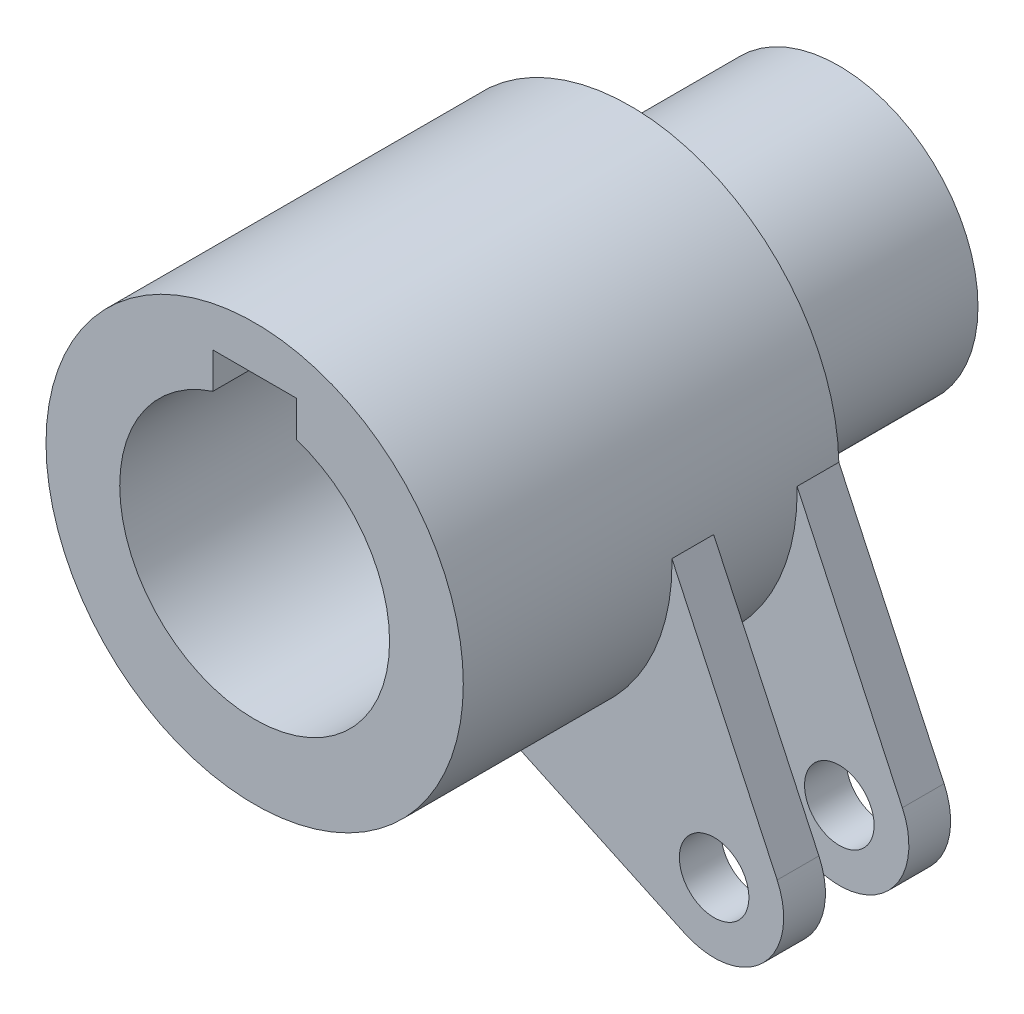
ISO-10303-21;
HEADER;
FILE_DESCRIPTION(('STEP AP214'),'2;1');
FILE_NAME('part.step','',(''),(''),'','','');
FILE_SCHEMA(('AUTOMOTIVE_DESIGN { 1 0 10303 214 1 1 1 1 }'));
ENDSEC;
DATA;
#1=APPLICATION_CONTEXT('core data for automotive mechanical design processes');
#2=APPLICATION_PROTOCOL_DEFINITION('international standard','automotive_design',2000,#1);
#3=PRODUCT_CONTEXT('',#1,'mechanical');
#4=PRODUCT('Part','Part','',(#3));
#5=PRODUCT_RELATED_PRODUCT_CATEGORY('part','',(#4));
#6=PRODUCT_DEFINITION_FORMATION('','',#4);
#7=PRODUCT_DEFINITION_CONTEXT('part definition',#1,'design');
#8=PRODUCT_DEFINITION('design','',#6,#7);
#9=PRODUCT_DEFINITION_SHAPE('','',#8);
#10=(LENGTH_UNIT() NAMED_UNIT(*) SI_UNIT(.MILLI.,.METRE.));
#11=(NAMED_UNIT(*) PLANE_ANGLE_UNIT() SI_UNIT($,.RADIAN.));
#12=(NAMED_UNIT(*) SI_UNIT($,.STERADIAN.) SOLID_ANGLE_UNIT());
#13=UNCERTAINTY_MEASURE_WITH_UNIT(LENGTH_MEASURE(1.E-05),#10,'distance_accuracy_value','');
#14=(GEOMETRIC_REPRESENTATION_CONTEXT(3) GLOBAL_UNCERTAINTY_ASSIGNED_CONTEXT((#13)) GLOBAL_UNIT_ASSIGNED_CONTEXT((#10,
#11,#12)) REPRESENTATION_CONTEXT('',''));
#15=CARTESIAN_POINT('',(0.,0.,0.));
#16=DIRECTION('',(0.,0.,1.));
#17=DIRECTION('',(1.,0.,0.));
#18=AXIS2_PLACEMENT_3D('',#15,#16,#17);
#19=CARTESIAN_POINT('',(0.,0.,0.));
#20=DIRECTION('',(0.,0.,1.));
#21=DIRECTION('',(1.,0.,0.));
#22=AXIS2_PLACEMENT_3D('',#19,#20,#21);
#23=PLANE('',#22);
#24=CARTESIAN_POINT('',(0.,0.,0.));
#25=DIRECTION('',(0.,0.,1.));
#26=DIRECTION('',(1.,0.,0.));
#27=AXIS2_PLACEMENT_3D('',#24,#25,#26);
#28=CIRCLE('',#27,4.1);
#29=CARTESIAN_POINT('',(-2.,3.57910603363466,0.));
#30=VERTEX_POINT('',#29);
#31=CARTESIAN_POINT('',(2.,3.57910603363466,0.));
#32=VERTEX_POINT('',#31);
#33=EDGE_CURVE('E320',#30,#32,#28,.T.);
#34=ORIENTED_EDGE('',*,*,#33,.F.);
#35=DIRECTION('',(0.,1.,0.));
#36=VECTOR('',#35,1.);
#37=CARTESIAN_POINT('',(-2.,0.,0.));
#38=LINE('',#37,#36);
#39=CARTESIAN_POINT('',(-2.,5.1,0.));
#40=VERTEX_POINT('',#39);
#41=EDGE_CURVE('E332',#30,#40,#38,.T.);
#42=ORIENTED_EDGE('',*,*,#41,.T.);
#43=DIRECTION('',(1.,0.,0.));
#44=VECTOR('',#43,1.);
#45=CARTESIAN_POINT('',(0.,5.1,0.));
#46=LINE('',#45,#44);
#47=CARTESIAN_POINT('',(2.,5.1,0.));
#48=VERTEX_POINT('',#47);
#49=EDGE_CURVE('E335',#40,#48,#46,.T.);
#50=ORIENTED_EDGE('',*,*,#49,.T.);
#51=DIRECTION('',(0.,1.,0.));
#52=VECTOR('',#51,1.);
#53=CARTESIAN_POINT('',(2.,0.,0.));
#54=LINE('',#53,#52);
#55=EDGE_CURVE('E329',#32,#48,#54,.T.);
#56=ORIENTED_EDGE('',*,*,#55,.F.);
#57=EDGE_LOOP('',(#34,#42,#50,#56));
#58=FACE_BOUND('',#57,.T.);
#59=DIRECTION('',(0.,-1.,0.));
#60=VECTOR('',#59,1.);
#61=CARTESIAN_POINT('',(-3.,0.,0.));
#62=LINE('',#61,#60);
#63=CARTESIAN_POINT('',(-3.,11.8,0.));
#64=VERTEX_POINT('',#63);
#65=CARTESIAN_POINT('',(-3.,9.22442410126508,0.));
#66=VERTEX_POINT('',#65);
#67=EDGE_CURVE('E230',#64,#66,#62,.T.);
#68=ORIENTED_EDGE('',*,*,#67,.T.);
#69=CARTESIAN_POINT('',(0.,0.,0.));
#70=DIRECTION('',(0.,0.,1.));
#71=DIRECTION('',(1.,0.,0.));
#72=AXIS2_PLACEMENT_3D('',#69,#70,#71);
#73=CIRCLE('',#72,9.7);
#74=CARTESIAN_POINT('',(3.,9.22442410126508,0.));
#75=VERTEX_POINT('',#74);
#76=EDGE_CURVE('E100',#66,#75,#73,.T.);
#77=ORIENTED_EDGE('',*,*,#76,.T.);
#78=DIRECTION('',(0.,-1.,0.));
#79=VECTOR('',#78,1.);
#80=CARTESIAN_POINT('',(3.,0.,0.));
#81=LINE('',#80,#79);
#82=CARTESIAN_POINT('',(3.,11.8,0.));
#83=VERTEX_POINT('',#82);
#84=EDGE_CURVE('E216',#83,#75,#81,.T.);
#85=ORIENTED_EDGE('',*,*,#84,.F.);
#86=DIRECTION('',(1.,0.,0.));
#87=VECTOR('',#86,1.);
#88=CARTESIAN_POINT('',(0.,11.8,0.));
#89=LINE('',#88,#87);
#90=EDGE_CURVE('E232',#64,#83,#89,.T.);
#91=ORIENTED_EDGE('',*,*,#90,.F.);
#92=EDGE_LOOP('',(#68,#77,#85,#91));
#93=FACE_BOUND('',#92,.T.);
#94=ADVANCED_FACE('F83',(#58,#93),#23,.T.);
#95=CARTESIAN_POINT('',(0.,0.,-12.));
#96=DIRECTION('',(0.,0.,1.));
#97=DIRECTION('',(1.,0.,0.));
#98=AXIS2_PLACEMENT_3D('',#95,#96,#97);
#99=CYLINDRICAL_SURFACE('',#98,15.);
#100=DIRECTION('',(0.,0.,1.));
#101=VECTOR('',#100,1.);
#102=CARTESIAN_POINT('',(-0.307001553926883,-14.996858005792,-3.));
#103=LINE('',#102,#101);
#104=CARTESIAN_POINT('',(-0.307001553926883,-14.996858005792,-3.));
#105=VERTEX_POINT('',#104);
#106=CARTESIAN_POINT('',(-0.307001553926883,-14.996858005792,0.));
#107=VERTEX_POINT('',#106);
#108=EDGE_CURVE('E321',#105,#107,#103,.T.);
#109=ORIENTED_EDGE('',*,*,#108,.T.);
#110=CARTESIAN_POINT('',(0.,0.,0.));
#111=DIRECTION('',(0.,0.,1.));
#112=DIRECTION('',(1.,0.,0.));
#113=AXIS2_PLACEMENT_3D('',#110,#111,#112);
#114=CIRCLE('',#113,15.);
#115=CARTESIAN_POINT('',(14.996858005792,0.307001553926838,0.));
#116=VERTEX_POINT('',#115);
#117=EDGE_CURVE('E12',#107,#116,#114,.T.);
#118=ORIENTED_EDGE('',*,*,#117,.T.);
#119=DIRECTION('',(0.,0.,1.));
#120=VECTOR('',#119,1.);
#121=CARTESIAN_POINT('',(14.996858005792,0.307001553926839,-3.));
#122=LINE('',#121,#120);
#123=CARTESIAN_POINT('',(14.996858005792,0.307001553926839,-3.));
#124=VERTEX_POINT('',#123);
#125=EDGE_CURVE('E324',#124,#116,#122,.T.);
#126=ORIENTED_EDGE('',*,*,#125,.F.);
#127=CARTESIAN_POINT('',(0.,0.,-3.));
#128=DIRECTION('',(0.,0.,1.));
#129=DIRECTION('',(1.,0.,0.));
#130=AXIS2_PLACEMENT_3D('',#127,#128,#129);
#131=CIRCLE('',#130,15.);
#132=EDGE_CURVE('E305',#105,#124,#131,.T.);
#133=ORIENTED_EDGE('',*,*,#132,.F.);
#134=EDGE_LOOP('',(#109,#118,#126,#133));
#135=FACE_BOUND('',#134,.T.);
#136=CARTESIAN_POINT('',(0.,0.,-9.));
#137=DIRECTION('',(0.,0.,1.));
#138=DIRECTION('',(1.,0.,0.));
#139=AXIS2_PLACEMENT_3D('',#136,#137,#138);
#140=CIRCLE('',#139,15.);
#141=CARTESIAN_POINT('',(-0.307001553926882,-14.996858005792,-9.));
#142=VERTEX_POINT('',#141);
#143=CARTESIAN_POINT('',(14.996858005792,0.307001553926842,-9.));
#144=VERTEX_POINT('',#143);
#145=EDGE_CURVE('E108',#142,#144,#140,.T.);
#146=ORIENTED_EDGE('',*,*,#145,.T.);
#147=DIRECTION('',(0.,0.,-1.));
#148=VECTOR('',#147,1.);
#149=CARTESIAN_POINT('',(14.996858005792,0.307001553926839,-9.));
#150=LINE('',#149,#148);
#151=CARTESIAN_POINT('',(14.996858005792,0.307001553926839,-12.));
#152=VERTEX_POINT('',#151);
#153=EDGE_CURVE('E287',#144,#152,#150,.T.);
#154=ORIENTED_EDGE('',*,*,#153,.T.);
#155=CARTESIAN_POINT('',(0.,0.,-12.));
#156=DIRECTION('',(0.,0.,1.));
#157=DIRECTION('',(1.,0.,0.));
#158=AXIS2_PLACEMENT_3D('',#155,#156,#157);
#159=CIRCLE('',#158,15.);
#160=CARTESIAN_POINT('',(-0.307001553926894,-14.996858005792,-12.));
#161=VERTEX_POINT('',#160);
#162=EDGE_CURVE('E327',#152,#161,#159,.T.);
#163=ORIENTED_EDGE('',*,*,#162,.T.);
#164=DIRECTION('',(0.,0.,-1.));
#165=VECTOR('',#164,1.);
#166=CARTESIAN_POINT('',(-0.307001553926885,-14.996858005792,-9.));
#167=LINE('',#166,#165);
#168=EDGE_CURVE('E284',#142,#161,#167,.T.);
#169=ORIENTED_EDGE('',*,*,#168,.F.);
#170=EDGE_LOOP('',(#146,#154,#163,#169));
#171=FACE_BOUND('',#170,.T.);
#172=CARTESIAN_POINT('',(0.,0.,15.));
#173=DIRECTION('',(0.,0.,1.));
#174=DIRECTION('',(1.,0.,0.));
#175=AXIS2_PLACEMENT_3D('',#172,#173,#174);
#176=CIRCLE('',#175,15.);
#177=CARTESIAN_POINT('',(15.,0.,15.));
#178=VERTEX_POINT('',#177);
#179=EDGE_CURVE('E225',#178,#178,#176,.T.);
#180=ORIENTED_EDGE('',*,*,#179,.F.);
#181=EDGE_LOOP('',(#180));
#182=FACE_BOUND('',#181,.T.);
#183=ADVANCED_FACE('F368',(#135,#171,#182),#99,.T.);
#184=CARTESIAN_POINT('',(0.,0.,-12.));
#185=DIRECTION('',(0.,0.,1.));
#186=DIRECTION('',(1.,0.,0.));
#187=AXIS2_PLACEMENT_3D('',#184,#185,#186);
#188=CYLINDRICAL_SURFACE('',#187,4.1);
#189=ORIENTED_EDGE('',*,*,#33,.T.);
#190=DIRECTION('',(0.,0.,1.));
#191=VECTOR('',#190,1.);
#192=CARTESIAN_POINT('',(2.,3.57910603363466,-12.));
#193=LINE('',#192,#191);
#194=CARTESIAN_POINT('',(2.,3.57910603363465,-27.));
#195=VERTEX_POINT('',#194);
#196=EDGE_CURVE('E92',#195,#32,#193,.T.);
#197=ORIENTED_EDGE('',*,*,#196,.F.);
#198=CARTESIAN_POINT('',(0.,0.,-27.));
#199=DIRECTION('',(0.,0.,1.));
#200=DIRECTION('',(1.,0.,0.));
#201=AXIS2_PLACEMENT_3D('',#198,#199,#200);
#202=CIRCLE('',#201,4.1);
#203=CARTESIAN_POINT('',(-2.,3.57910603363466,-27.));
#204=VERTEX_POINT('',#203);
#205=EDGE_CURVE('E246',#204,#195,#202,.T.);
#206=ORIENTED_EDGE('',*,*,#205,.F.);
#207=DIRECTION('',(0.,0.,1.));
#208=VECTOR('',#207,1.);
#209=CARTESIAN_POINT('',(-2.,3.57910603363466,-12.));
#210=LINE('',#209,#208);
#211=EDGE_CURVE('E87',#204,#30,#210,.T.);
#212=ORIENTED_EDGE('',*,*,#211,.T.);
#213=EDGE_LOOP('',(#189,#197,#206,#212));
#214=FACE_BOUND('',#213,.T.);
#215=ADVANCED_FACE('F85',(#214),#188,.F.);
#216=CARTESIAN_POINT('',(2.,0.,-12.));
#217=DIRECTION('',(1.,0.,0.));
#218=DIRECTION('',(0.,0.,-1.));
#219=AXIS2_PLACEMENT_3D('',#216,#217,#218);
#220=PLANE('',#219);
#221=ORIENTED_EDGE('',*,*,#55,.T.);
#222=DIRECTION('',(0.,0.,1.));
#223=VECTOR('',#222,1.);
#224=CARTESIAN_POINT('',(2.,5.1,-12.));
#225=LINE('',#224,#223);
#226=CARTESIAN_POINT('',(2.,5.1,-27.));
#227=VERTEX_POINT('',#226);
#228=EDGE_CURVE('E342',#227,#48,#225,.T.);
#229=ORIENTED_EDGE('',*,*,#228,.F.);
#230=DIRECTION('',(0.,1.,0.));
#231=VECTOR('',#230,1.);
#232=CARTESIAN_POINT('',(2.,0.,-27.));
#233=LINE('',#232,#231);
#234=EDGE_CURVE('E243',#195,#227,#233,.T.);
#235=ORIENTED_EDGE('',*,*,#234,.F.);
#236=ORIENTED_EDGE('',*,*,#196,.T.);
#237=EDGE_LOOP('',(#221,#229,#235,#236));
#238=FACE_BOUND('',#237,.T.);
#239=ADVANCED_FACE('F364',(#238),#220,.F.);
#240=CARTESIAN_POINT('',(0.,5.1,-12.));
#241=DIRECTION('',(0.,-1.,0.));
#242=DIRECTION('',(0.,0.,-1.));
#243=AXIS2_PLACEMENT_3D('',#240,#241,#242);
#244=PLANE('',#243);
#245=ORIENTED_EDGE('',*,*,#49,.F.);
#246=DIRECTION('',(0.,0.,1.));
#247=VECTOR('',#246,1.);
#248=CARTESIAN_POINT('',(-2.,5.1,-12.));
#249=LINE('',#248,#247);
#250=CARTESIAN_POINT('',(-2.,5.1,-27.));
#251=VERTEX_POINT('',#250);
#252=EDGE_CURVE('E343',#251,#40,#249,.T.);
#253=ORIENTED_EDGE('',*,*,#252,.F.);
#254=DIRECTION('',(1.,0.,0.));
#255=VECTOR('',#254,1.);
#256=CARTESIAN_POINT('',(0.,5.1,-27.));
#257=LINE('',#256,#255);
#258=EDGE_CURVE('E205',#251,#227,#257,.T.);
#259=ORIENTED_EDGE('',*,*,#258,.T.);
#260=ORIENTED_EDGE('',*,*,#228,.T.);
#261=EDGE_LOOP('',(#245,#253,#259,#260));
#262=FACE_BOUND('',#261,.T.);
#263=ADVANCED_FACE('F356',(#262),#244,.T.);
#264=CARTESIAN_POINT('',(-2.,0.,-12.));
#265=DIRECTION('',(1.,0.,0.));
#266=DIRECTION('',(0.,0.,-1.));
#267=AXIS2_PLACEMENT_3D('',#264,#265,#266);
#268=PLANE('',#267);
#269=ORIENTED_EDGE('',*,*,#41,.F.);
#270=ORIENTED_EDGE('',*,*,#211,.F.);
#271=DIRECTION('',(0.,1.,0.));
#272=VECTOR('',#271,1.);
#273=CARTESIAN_POINT('',(-2.,0.,-27.));
#274=LINE('',#273,#272);
#275=EDGE_CURVE('E249',#204,#251,#274,.T.);
#276=ORIENTED_EDGE('',*,*,#275,.T.);
#277=ORIENTED_EDGE('',*,*,#252,.T.);
#278=EDGE_LOOP('',(#269,#270,#276,#277));
#279=FACE_BOUND('',#278,.T.);
#280=ADVANCED_FACE('F353',(#279),#268,.T.);
#281=CARTESIAN_POINT('',(0.,0.,-12.));
#282=DIRECTION('',(0.,0.,1.));
#283=DIRECTION('',(1.,0.,0.));
#284=AXIS2_PLACEMENT_3D('',#281,#282,#283);
#285=PLANE('',#284);
#286=CARTESIAN_POINT('',(0.,0.,-12.));
#287=DIRECTION('',(0.,0.,1.));
#288=DIRECTION('',(1.,0.,0.));
#289=AXIS2_PLACEMENT_3D('',#286,#287,#288);
#290=CIRCLE('',#289,10.);
#291=CARTESIAN_POINT('',(10.,0.,-12.));
#292=VERTEX_POINT('',#291);
#293=EDGE_CURVE('E252',#292,#292,#290,.T.);
#294=ORIENTED_EDGE('',*,*,#293,.T.);
#295=EDGE_LOOP('',(#294));
#296=FACE_BOUND('',#295,.T.);
#297=ORIENTED_EDGE('',*,*,#162,.F.);
#298=DIRECTION('',(-0.422618261740704,0.906307787036648,0.));
#299=VECTOR('',#298,1.);
#300=CARTESIAN_POINT('',(12.4359146752789,5.79896224924477,-12.));
#301=LINE('',#300,#299);
#302=CARTESIAN_POINT('',(22.5627618554402,-15.9181316115535,-12.));
#303=VERTEX_POINT('',#302);
#304=EDGE_CURVE('E278',#303,#152,#301,.T.);
#305=ORIENTED_EDGE('',*,*,#304,.F.);
#306=CARTESIAN_POINT('',(18.0312229202569,-18.031222920257,-12.));
#307=DIRECTION('',(0.,0.,1.));
#308=DIRECTION('',(1.,0.,0.));
#309=AXIS2_PLACEMENT_3D('',#306,#307,#308);
#310=CIRCLE('',#309,5.);
#311=CARTESIAN_POINT('',(15.9181316115534,-22.5627618554402,-12.));
#312=VERTEX_POINT('',#311);
#313=EDGE_CURVE('E262',#312,#303,#310,.T.);
#314=ORIENTED_EDGE('',*,*,#313,.F.);
#315=DIRECTION('',(-0.906307787036647,0.422618261740706,0.));
#316=VECTOR('',#315,1.);
#317=CARTESIAN_POINT('',(-5.79896224924481,-12.4359146752789,-12.));
#318=LINE('',#317,#316);
#319=EDGE_CURVE('E269',#312,#161,#318,.T.);
#320=ORIENTED_EDGE('',*,*,#319,.T.);
#321=EDGE_LOOP('',(#297,#305,#314,#320));
#322=FACE_BOUND('',#321,.T.);
#323=CARTESIAN_POINT('',(18.0312229202569,-18.031222920257,-12.));
#324=DIRECTION('',(0.,0.,1.));
#325=DIRECTION('',(1.,0.,0.));
#326=AXIS2_PLACEMENT_3D('',#323,#324,#325);
#327=CIRCLE('',#326,2.5);
#328=CARTESIAN_POINT('',(20.5312229202569,-18.031222920257,-12.));
#329=VERTEX_POINT('',#328);
#330=EDGE_CURVE('E256',#329,#329,#327,.T.);
#331=ORIENTED_EDGE('',*,*,#330,.T.);
#332=EDGE_LOOP('',(#331));
#333=FACE_BOUND('',#332,.T.);
#334=ADVANCED_FACE('F355',(#296,#322,#333),#285,.F.);
#335=ORIENTED_EDGE('',*,*,#117,.F.);
#336=DIRECTION('',(0.906307787036647,-0.422618261740706,0.));
#337=VECTOR('',#336,1.);
#338=CARTESIAN_POINT('',(-5.79896224924481,-12.4359146752789,0.));
#339=LINE('',#338,#337);
#340=CARTESIAN_POINT('',(15.9181316115534,-22.5627618554402,0.));
#341=VERTEX_POINT('',#340);
#342=EDGE_CURVE('E303',#107,#341,#339,.T.);
#343=ORIENTED_EDGE('',*,*,#342,.T.);
#344=CARTESIAN_POINT('',(18.0312229202569,-18.031222920257,0.));
#345=DIRECTION('',(0.,0.,1.));
#346=DIRECTION('',(1.,0.,0.));
#347=AXIS2_PLACEMENT_3D('',#344,#345,#346);
#348=CIRCLE('',#347,5.);
#349=CARTESIAN_POINT('',(22.5627618554402,-15.9181316115535,0.));
#350=VERTEX_POINT('',#349);
#351=EDGE_CURVE('E296',#341,#350,#348,.T.);
#352=ORIENTED_EDGE('',*,*,#351,.T.);
#353=DIRECTION('',(0.422618261740704,-0.906307787036648,0.));
#354=VECTOR('',#353,1.);
#355=CARTESIAN_POINT('',(12.4359146752789,5.79896224924477,0.));
#356=LINE('',#355,#354);
#357=EDGE_CURVE('E313',#116,#350,#356,.T.);
#358=ORIENTED_EDGE('',*,*,#357,.F.);
#359=EDGE_LOOP('',(#335,#343,#352,#358));
#360=FACE_BOUND('',#359,.T.);
#361=CARTESIAN_POINT('',(18.0312229202569,-18.031222920257,0.));
#362=DIRECTION('',(0.,0.,1.));
#363=DIRECTION('',(1.,0.,0.));
#364=AXIS2_PLACEMENT_3D('',#361,#362,#363);
#365=CIRCLE('',#364,2.5);
#366=CARTESIAN_POINT('',(20.5312229202569,-18.031222920257,0.));
#367=VERTEX_POINT('',#366);
#368=EDGE_CURVE('E292',#367,#367,#365,.T.);
#369=ORIENTED_EDGE('',*,*,#368,.F.);
#370=EDGE_LOOP('',(#369));
#371=FACE_BOUND('',#370,.T.);
#372=ADVANCED_FACE('F361',(#360,#371),#23,.T.);
#373=CARTESIAN_POINT('',(18.0312229202569,-18.031222920257,-3.));
#374=DIRECTION('',(0.,0.,1.));
#375=DIRECTION('',(1.,0.,0.));
#376=AXIS2_PLACEMENT_3D('',#373,#374,#375);
#377=CYLINDRICAL_SURFACE('',#376,5.);
#378=ORIENTED_EDGE('',*,*,#351,.F.);
#379=DIRECTION('',(0.,0.,1.));
#380=VECTOR('',#379,1.);
#381=CARTESIAN_POINT('',(15.9181316115534,-22.5627618554402,-3.));
#382=LINE('',#381,#380);
#383=CARTESIAN_POINT('',(15.9181316115534,-22.5627618554402,-3.));
#384=VERTEX_POINT('',#383);
#385=EDGE_CURVE('E318',#384,#341,#382,.T.);
#386=ORIENTED_EDGE('',*,*,#385,.F.);
#387=CARTESIAN_POINT('',(18.0312229202569,-18.031222920257,-3.));
#388=DIRECTION('',(0.,0.,1.));
#389=DIRECTION('',(1.,0.,0.));
#390=AXIS2_PLACEMENT_3D('',#387,#388,#389);
#391=CIRCLE('',#390,5.);
#392=CARTESIAN_POINT('',(22.5627618554402,-15.9181316115535,-3.));
#393=VERTEX_POINT('',#392);
#394=EDGE_CURVE('E299',#384,#393,#391,.T.);
#395=ORIENTED_EDGE('',*,*,#394,.T.);
#396=DIRECTION('',(0.,0.,1.));
#397=VECTOR('',#396,1.);
#398=CARTESIAN_POINT('',(22.5627618554402,-15.9181316115535,-3.));
#399=LINE('',#398,#397);
#400=EDGE_CURVE('E310',#393,#350,#399,.T.);
#401=ORIENTED_EDGE('',*,*,#400,.T.);
#402=EDGE_LOOP('',(#378,#386,#395,#401));
#403=FACE_BOUND('',#402,.T.);
#404=ADVANCED_FACE('F376',(#403),#377,.T.);
#405=CARTESIAN_POINT('',(-5.79896224924481,-12.4359146752789,-3.));
#406=DIRECTION('',(-0.422618261740707,-0.906307787036647,0.));
#407=DIRECTION('',(0.906307787036647,-0.422618261740707,0.));
#408=AXIS2_PLACEMENT_3D('',#405,#406,#407);
#409=PLANE('',#408);
#410=ORIENTED_EDGE('',*,*,#342,.F.);
#411=ORIENTED_EDGE('',*,*,#108,.F.);
#412=DIRECTION('',(0.906307787036647,-0.422618261740706,0.));
#413=VECTOR('',#412,1.);
#414=CARTESIAN_POINT('',(-5.79896224924481,-12.4359146752789,-3.));
#415=LINE('',#414,#413);
#416=EDGE_CURVE('E307',#105,#384,#415,.T.);
#417=ORIENTED_EDGE('',*,*,#416,.T.);
#418=ORIENTED_EDGE('',*,*,#385,.T.);
#419=EDGE_LOOP('',(#410,#411,#417,#418));
#420=FACE_BOUND('',#419,.T.);
#421=ADVANCED_FACE('F381',(#420),#409,.T.);
#422=CARTESIAN_POINT('',(12.4359146752789,5.79896224924477,-3.));
#423=DIRECTION('',(-0.906307787036648,-0.422618261740704,0.));
#424=DIRECTION('',(0.422618261740704,-0.906307787036648,0.));
#425=AXIS2_PLACEMENT_3D('',#422,#423,#424);
#426=PLANE('',#425);
#427=ORIENTED_EDGE('',*,*,#357,.T.);
#428=ORIENTED_EDGE('',*,*,#400,.F.);
#429=DIRECTION('',(0.422618261740704,-0.906307787036648,0.));
#430=VECTOR('',#429,1.);
#431=CARTESIAN_POINT('',(12.4359146752789,5.79896224924477,-3.));
#432=LINE('',#431,#430);
#433=EDGE_CURVE('E302',#124,#393,#432,.T.);
#434=ORIENTED_EDGE('',*,*,#433,.F.);
#435=ORIENTED_EDGE('',*,*,#125,.T.);
#436=EDGE_LOOP('',(#427,#428,#434,#435));
#437=FACE_BOUND('',#436,.T.);
#438=ADVANCED_FACE('F402',(#437),#426,.F.);
#439=CARTESIAN_POINT('',(18.0312229202569,-18.031222920257,-3.));
#440=DIRECTION('',(0.,0.,1.));
#441=DIRECTION('',(1.,0.,0.));
#442=AXIS2_PLACEMENT_3D('',#439,#440,#441);
#443=PLANE('',#442);
#444=CARTESIAN_POINT('',(18.0312229202569,-18.031222920257,-3.));
#445=DIRECTION('',(0.,0.,1.));
#446=DIRECTION('',(1.,0.,0.));
#447=AXIS2_PLACEMENT_3D('',#444,#445,#446);
#448=CIRCLE('',#447,2.5);
#449=CARTESIAN_POINT('',(20.5312229202569,-18.031222920257,-3.));
#450=VERTEX_POINT('',#449);
#451=EDGE_CURVE('E293',#450,#450,#448,.T.);
#452=ORIENTED_EDGE('',*,*,#451,.T.);
#453=EDGE_LOOP('',(#452));
#454=FACE_BOUND('',#453,.T.);
#455=ORIENTED_EDGE('',*,*,#394,.F.);
#456=ORIENTED_EDGE('',*,*,#416,.F.);
#457=ORIENTED_EDGE('',*,*,#132,.T.);
#458=ORIENTED_EDGE('',*,*,#433,.T.);
#459=EDGE_LOOP('',(#455,#456,#457,#458));
#460=FACE_BOUND('',#459,.T.);
#461=ADVANCED_FACE('F392',(#454,#460),#443,.F.);
#462=CARTESIAN_POINT('',(18.0312229202569,-18.031222920257,-3.));
#463=DIRECTION('',(0.,0.,1.));
#464=DIRECTION('',(1.,0.,0.));
#465=AXIS2_PLACEMENT_3D('',#462,#463,#464);
#466=CYLINDRICAL_SURFACE('',#465,2.5);
#467=ORIENTED_EDGE('',*,*,#451,.F.);
#468=EDGE_LOOP('',(#467));
#469=FACE_BOUND('',#468,.T.);
#470=ORIENTED_EDGE('',*,*,#368,.T.);
#471=EDGE_LOOP('',(#470));
#472=FACE_BOUND('',#471,.T.);
#473=ADVANCED_FACE('F389',(#469,#472),#466,.F.);
#474=CARTESIAN_POINT('',(18.0312229202569,-18.031222920257,-9.));
#475=DIRECTION('',(0.,0.,1.));
#476=DIRECTION('',(1.,0.,0.));
#477=AXIS2_PLACEMENT_3D('',#474,#475,#476);
#478=PLANE('',#477);
#479=CARTESIAN_POINT('',(18.0312229202569,-18.031222920257,-9.));
#480=DIRECTION('',(0.,0.,1.));
#481=DIRECTION('',(1.,0.,0.));
#482=AXIS2_PLACEMENT_3D('',#479,#480,#481);
#483=CIRCLE('',#482,5.);
#484=CARTESIAN_POINT('',(15.9181316115534,-22.5627618554402,-9.));
#485=VERTEX_POINT('',#484);
#486=CARTESIAN_POINT('',(22.5627618554402,-15.9181316115535,-9.));
#487=VERTEX_POINT('',#486);
#488=EDGE_CURVE('E265',#485,#487,#483,.T.);
#489=ORIENTED_EDGE('',*,*,#488,.T.);
#490=DIRECTION('',(-0.422618261740704,0.906307787036648,0.));
#491=VECTOR('',#490,1.);
#492=CARTESIAN_POINT('',(12.4359146752789,5.79896224924477,-9.));
#493=LINE('',#492,#491);
#494=EDGE_CURVE('E268',#487,#144,#493,.T.);
#495=ORIENTED_EDGE('',*,*,#494,.T.);
#496=ORIENTED_EDGE('',*,*,#145,.F.);
#497=DIRECTION('',(-0.906307787036647,0.422618261740706,0.));
#498=VECTOR('',#497,1.);
#499=CARTESIAN_POINT('',(-5.79896224924481,-12.4359146752789,-9.));
#500=LINE('',#499,#498);
#501=EDGE_CURVE('E272',#485,#142,#500,.T.);
#502=ORIENTED_EDGE('',*,*,#501,.F.);
#503=EDGE_LOOP('',(#489,#495,#496,#502));
#504=FACE_BOUND('',#503,.T.);
#505=CARTESIAN_POINT('',(18.0312229202569,-18.031222920257,-9.));
#506=DIRECTION('',(0.,0.,1.));
#507=DIRECTION('',(1.,0.,0.));
#508=AXIS2_PLACEMENT_3D('',#505,#506,#507);
#509=CIRCLE('',#508,2.5);
#510=CARTESIAN_POINT('',(20.5312229202569,-18.031222920257,-9.));
#511=VERTEX_POINT('',#510);
#512=EDGE_CURVE('E259',#511,#511,#509,.T.);
#513=ORIENTED_EDGE('',*,*,#512,.F.);
#514=EDGE_LOOP('',(#513));
#515=FACE_BOUND('',#514,.T.);
#516=ADVANCED_FACE('F391',(#504,#515),#478,.T.);
#517=CARTESIAN_POINT('',(18.0312229202569,-18.031222920257,-9.));
#518=DIRECTION('',(0.,0.,-1.));
#519=DIRECTION('',(-1.,0.,0.));
#520=AXIS2_PLACEMENT_3D('',#517,#518,#519);
#521=CYLINDRICAL_SURFACE('',#520,5.);
#522=ORIENTED_EDGE('',*,*,#313,.T.);
#523=DIRECTION('',(0.,0.,-1.));
#524=VECTOR('',#523,1.);
#525=CARTESIAN_POINT('',(22.5627618554402,-15.9181316115535,-9.));
#526=LINE('',#525,#524);
#527=EDGE_CURVE('E289',#487,#303,#526,.T.);
#528=ORIENTED_EDGE('',*,*,#527,.F.);
#529=ORIENTED_EDGE('',*,*,#488,.F.);
#530=DIRECTION('',(0.,0.,-1.));
#531=VECTOR('',#530,1.);
#532=CARTESIAN_POINT('',(15.9181316115534,-22.5627618554402,-9.));
#533=LINE('',#532,#531);
#534=EDGE_CURVE('E275',#485,#312,#533,.T.);
#535=ORIENTED_EDGE('',*,*,#534,.T.);
#536=EDGE_LOOP('',(#522,#528,#529,#535));
#537=FACE_BOUND('',#536,.T.);
#538=ADVANCED_FACE('F399',(#537),#521,.T.);
#539=CARTESIAN_POINT('',(12.4359146752789,5.79896224924477,-9.));
#540=DIRECTION('',(-0.906307787036648,-0.422618261740704,0.));
#541=DIRECTION('',(0.422618261740704,-0.906307787036648,0.));
#542=AXIS2_PLACEMENT_3D('',#539,#540,#541);
#543=PLANE('',#542);
#544=ORIENTED_EDGE('',*,*,#304,.T.);
#545=ORIENTED_EDGE('',*,*,#153,.F.);
#546=ORIENTED_EDGE('',*,*,#494,.F.);
#547=ORIENTED_EDGE('',*,*,#527,.T.);
#548=EDGE_LOOP('',(#544,#545,#546,#547));
#549=FACE_BOUND('',#548,.T.);
#550=ADVANCED_FACE('F457',(#549),#543,.F.);
#551=CARTESIAN_POINT('',(-5.79896224924481,-12.4359146752789,-9.));
#552=DIRECTION('',(-0.422618261740706,-0.906307787036647,0.));
#553=DIRECTION('',(0.906307787036647,-0.422618261740706,0.));
#554=AXIS2_PLACEMENT_3D('',#551,#552,#553);
#555=PLANE('',#554);
#556=ORIENTED_EDGE('',*,*,#319,.F.);
#557=ORIENTED_EDGE('',*,*,#534,.F.);
#558=ORIENTED_EDGE('',*,*,#501,.T.);
#559=ORIENTED_EDGE('',*,*,#168,.T.);
#560=EDGE_LOOP('',(#556,#557,#558,#559));
#561=FACE_BOUND('',#560,.T.);
#562=ADVANCED_FACE('F453',(#561),#555,.T.);
#563=CARTESIAN_POINT('',(18.0312229202569,-18.031222920257,-9.));
#564=DIRECTION('',(0.,0.,-1.));
#565=DIRECTION('',(-1.,0.,0.));
#566=AXIS2_PLACEMENT_3D('',#563,#564,#565);
#567=CYLINDRICAL_SURFACE('',#566,2.5);
#568=ORIENTED_EDGE('',*,*,#512,.T.);
#569=EDGE_LOOP('',(#568));
#570=FACE_BOUND('',#569,.T.);
#571=ORIENTED_EDGE('',*,*,#330,.F.);
#572=EDGE_LOOP('',(#571));
#573=FACE_BOUND('',#572,.T.);
#574=ADVANCED_FACE('F447',(#570,#573),#567,.F.);
#575=CARTESIAN_POINT('',(0.,0.,-27.));
#576=DIRECTION('',(0.,0.,1.));
#577=DIRECTION('',(1.,0.,0.));
#578=AXIS2_PLACEMENT_3D('',#575,#576,#577);
#579=PLANE('',#578);
#580=CARTESIAN_POINT('',(0.,0.,-27.));
#581=DIRECTION('',(0.,0.,1.));
#582=DIRECTION('',(1.,0.,0.));
#583=AXIS2_PLACEMENT_3D('',#580,#581,#582);
#584=CIRCLE('',#583,10.);
#585=CARTESIAN_POINT('',(10.,0.,-27.));
#586=VERTEX_POINT('',#585);
#587=EDGE_CURVE('E253',#586,#586,#584,.T.);
#588=ORIENTED_EDGE('',*,*,#587,.F.);
#589=EDGE_LOOP('',(#588));
#590=FACE_BOUND('',#589,.T.);
#591=ORIENTED_EDGE('',*,*,#258,.F.);
#592=ORIENTED_EDGE('',*,*,#275,.F.);
#593=ORIENTED_EDGE('',*,*,#205,.T.);
#594=ORIENTED_EDGE('',*,*,#234,.T.);
#595=EDGE_LOOP('',(#591,#592,#593,#594));
#596=FACE_BOUND('',#595,.T.);
#597=ADVANCED_FACE('F444',(#590,#596),#579,.F.);
#598=CARTESIAN_POINT('',(0.,0.,-27.));
#599=DIRECTION('',(0.,0.,1.));
#600=DIRECTION('',(1.,0.,0.));
#601=AXIS2_PLACEMENT_3D('',#598,#599,#600);
#602=CYLINDRICAL_SURFACE('',#601,10.);
#603=ORIENTED_EDGE('',*,*,#587,.T.);
#604=EDGE_LOOP('',(#603));
#605=FACE_BOUND('',#604,.T.);
#606=ORIENTED_EDGE('',*,*,#293,.F.);
#607=EDGE_LOOP('',(#606));
#608=FACE_BOUND('',#607,.T.);
#609=ADVANCED_FACE('F443',(#605,#608),#602,.T.);
#610=CARTESIAN_POINT('',(0.,0.,15.));
#611=DIRECTION('',(0.,0.,-1.));
#612=DIRECTION('',(-1.,0.,0.));
#613=AXIS2_PLACEMENT_3D('',#610,#611,#612);
#614=CYLINDRICAL_SURFACE('',#613,9.7);
#615=ORIENTED_EDGE('',*,*,#76,.F.);
#616=DIRECTION('',(0.,0.,-1.));
#617=VECTOR('',#616,1.);
#618=CARTESIAN_POINT('',(-3.,9.22442410126508,15.));
#619=LINE('',#618,#617);
#620=CARTESIAN_POINT('',(-3.,9.22442410126508,15.));
#621=VERTEX_POINT('',#620);
#622=EDGE_CURVE('E197',#621,#66,#619,.T.);
#623=ORIENTED_EDGE('',*,*,#622,.F.);
#624=CARTESIAN_POINT('',(0.,0.,15.));
#625=DIRECTION('',(0.,0.,1.));
#626=DIRECTION('',(1.,0.,0.));
#627=AXIS2_PLACEMENT_3D('',#624,#625,#626);
#628=CIRCLE('',#627,9.7);
#629=CARTESIAN_POINT('',(3.,9.22442410126508,15.));
#630=VERTEX_POINT('',#629);
#631=EDGE_CURVE('E200',#621,#630,#628,.T.);
#632=ORIENTED_EDGE('',*,*,#631,.T.);
#633=DIRECTION('',(0.,0.,-1.));
#634=VECTOR('',#633,1.);
#635=CARTESIAN_POINT('',(3.,9.22442410126508,15.));
#636=LINE('',#635,#634);
#637=EDGE_CURVE('E228',#630,#75,#636,.T.);
#638=ORIENTED_EDGE('',*,*,#637,.T.);
#639=EDGE_LOOP('',(#615,#623,#632,#638));
#640=FACE_BOUND('',#639,.T.);
#641=ADVANCED_FACE('F199',(#640),#614,.F.);
#642=CARTESIAN_POINT('',(-3.,0.,15.));
#643=DIRECTION('',(1.,0.,0.));
#644=DIRECTION('',(0.,1.,0.));
#645=AXIS2_PLACEMENT_3D('',#642,#643,#644);
#646=PLANE('',#645);
#647=ORIENTED_EDGE('',*,*,#67,.F.);
#648=DIRECTION('',(0.,0.,-1.));
#649=VECTOR('',#648,1.);
#650=CARTESIAN_POINT('',(-3.,11.8,15.));
#651=LINE('',#650,#649);
#652=CARTESIAN_POINT('',(-3.,11.8,15.));
#653=VERTEX_POINT('',#652);
#654=EDGE_CURVE('E206',#653,#64,#651,.T.);
#655=ORIENTED_EDGE('',*,*,#654,.F.);
#656=DIRECTION('',(0.,-1.,0.));
#657=VECTOR('',#656,1.);
#658=CARTESIAN_POINT('',(-3.,0.,15.));
#659=LINE('',#658,#657);
#660=EDGE_CURVE('E212',#653,#621,#659,.T.);
#661=ORIENTED_EDGE('',*,*,#660,.T.);
#662=ORIENTED_EDGE('',*,*,#622,.T.);
#663=EDGE_LOOP('',(#647,#655,#661,#662));
#664=FACE_BOUND('',#663,.T.);
#665=ADVANCED_FACE('F218',(#664),#646,.T.);
#666=CARTESIAN_POINT('',(0.,11.8,15.));
#667=DIRECTION('',(0.,1.,0.));
#668=DIRECTION('',(0.,0.,1.));
#669=AXIS2_PLACEMENT_3D('',#666,#667,#668);
#670=PLANE('',#669);
#671=ORIENTED_EDGE('',*,*,#90,.T.);
#672=DIRECTION('',(0.,0.,-1.));
#673=VECTOR('',#672,1.);
#674=CARTESIAN_POINT('',(3.,11.8,15.));
#675=LINE('',#674,#673);
#676=CARTESIAN_POINT('',(3.,11.8,15.));
#677=VERTEX_POINT('',#676);
#678=EDGE_CURVE('E237',#677,#83,#675,.T.);
#679=ORIENTED_EDGE('',*,*,#678,.F.);
#680=DIRECTION('',(1.,0.,0.));
#681=VECTOR('',#680,1.);
#682=CARTESIAN_POINT('',(0.,11.8,15.));
#683=LINE('',#682,#681);
#684=EDGE_CURVE('E220',#653,#677,#683,.T.);
#685=ORIENTED_EDGE('',*,*,#684,.F.);
#686=ORIENTED_EDGE('',*,*,#654,.T.);
#687=EDGE_LOOP('',(#671,#679,#685,#686));
#688=FACE_BOUND('',#687,.T.);
#689=ADVANCED_FACE('F432',(#688),#670,.F.);
#690=CARTESIAN_POINT('',(3.,0.,15.));
#691=DIRECTION('',(1.,0.,0.));
#692=DIRECTION('',(0.,0.,-1.));
#693=AXIS2_PLACEMENT_3D('',#690,#691,#692);
#694=PLANE('',#693);
#695=ORIENTED_EDGE('',*,*,#84,.T.);
#696=ORIENTED_EDGE('',*,*,#637,.F.);
#697=DIRECTION('',(0.,-1.,0.));
#698=VECTOR('',#697,1.);
#699=CARTESIAN_POINT('',(3.,0.,15.));
#700=LINE('',#699,#698);
#701=EDGE_CURVE('E214',#677,#630,#700,.T.);
#702=ORIENTED_EDGE('',*,*,#701,.F.);
#703=ORIENTED_EDGE('',*,*,#678,.T.);
#704=EDGE_LOOP('',(#695,#696,#702,#703));
#705=FACE_BOUND('',#704,.T.);
#706=ADVANCED_FACE('F427',(#705),#694,.F.);
#707=CARTESIAN_POINT('',(0.,0.,15.));
#708=DIRECTION('',(0.,0.,1.));
#709=DIRECTION('',(1.,0.,0.));
#710=AXIS2_PLACEMENT_3D('',#707,#708,#709);
#711=PLANE('',#710);
#712=ORIENTED_EDGE('',*,*,#631,.F.);
#713=ORIENTED_EDGE('',*,*,#660,.F.);
#714=ORIENTED_EDGE('',*,*,#684,.T.);
#715=ORIENTED_EDGE('',*,*,#701,.T.);
#716=EDGE_LOOP('',(#712,#713,#714,#715));
#717=FACE_BOUND('',#716,.T.);
#718=ORIENTED_EDGE('',*,*,#179,.T.);
#719=EDGE_LOOP('',(#718));
#720=FACE_BOUND('',#719,.T.);
#721=ADVANCED_FACE('F210',(#717,#720),#711,.T.);
#722=CLOSED_SHELL('',(#94,#183,#215,#239,#263,#280,#334,#372,#404,#421,#438,#461,#473,#516,#538,
#550,#562,#574,#597,#609,#641,#665,#689,#706,#721));
#723=MANIFOLD_SOLID_BREP('B2',#722);
#724=ADVANCED_BREP_SHAPE_REPRESENTATION('',(#18,#723),#14);
#725=SHAPE_DEFINITION_REPRESENTATION(#9,#724);
ENDSEC;
END-ISO-10303-21;
